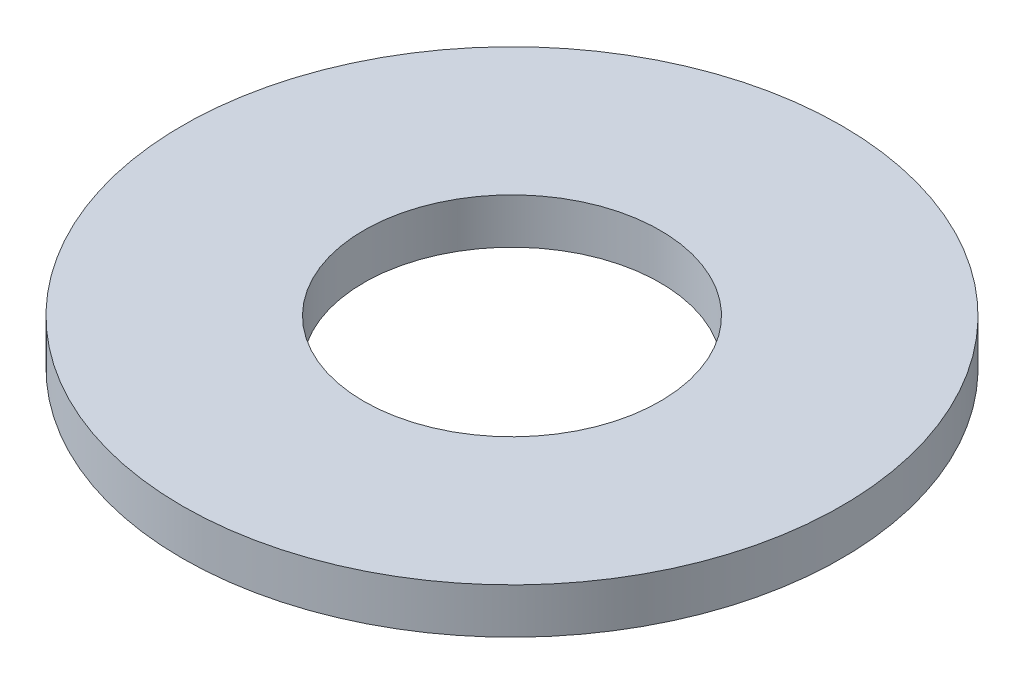
ISO-10303-21;
HEADER;
FILE_DESCRIPTION(('STEP AP214'),'2;1');
FILE_NAME('part.step','',(''),(''),'','','');
FILE_SCHEMA(('AUTOMOTIVE_DESIGN { 1 0 10303 214 1 1 1 1 }'));
ENDSEC;
DATA;
#1=APPLICATION_CONTEXT('core data for automotive mechanical design processes');
#2=APPLICATION_PROTOCOL_DEFINITION('international standard','automotive_design',2000,#1);
#3=PRODUCT_CONTEXT('',#1,'mechanical');
#4=PRODUCT('Part','Part','',(#3));
#5=PRODUCT_RELATED_PRODUCT_CATEGORY('part','',(#4));
#6=PRODUCT_DEFINITION_FORMATION('','',#4);
#7=PRODUCT_DEFINITION_CONTEXT('part definition',#1,'design');
#8=PRODUCT_DEFINITION('design','',#6,#7);
#9=PRODUCT_DEFINITION_SHAPE('','',#8);
#10=(LENGTH_UNIT() NAMED_UNIT(*) SI_UNIT(.MILLI.,.METRE.));
#11=(NAMED_UNIT(*) PLANE_ANGLE_UNIT() SI_UNIT($,.RADIAN.));
#12=(NAMED_UNIT(*) SI_UNIT($,.STERADIAN.) SOLID_ANGLE_UNIT());
#13=UNCERTAINTY_MEASURE_WITH_UNIT(LENGTH_MEASURE(1.E-05),#10,'distance_accuracy_value','');
#14=(GEOMETRIC_REPRESENTATION_CONTEXT(3) GLOBAL_UNCERTAINTY_ASSIGNED_CONTEXT((#13)) GLOBAL_UNIT_ASSIGNED_CONTEXT((#10,
#11,#12)) REPRESENTATION_CONTEXT('',''));
#15=CARTESIAN_POINT('',(0.,0.,0.));
#16=DIRECTION('',(0.,0.,1.));
#17=DIRECTION('',(1.,0.,0.));
#18=AXIS2_PLACEMENT_3D('',#15,#16,#17);
#19=CARTESIAN_POINT('',(0.,1.0922,0.));
#20=DIRECTION('',(0.,-1.,0.));
#21=DIRECTION('',(0.,0.,-1.));
#22=AXIS2_PLACEMENT_3D('',#19,#20,#21);
#23=CYLINDRICAL_SURFACE('',#22,7.9375);
#24=CARTESIAN_POINT('',(0.,1.0922,0.));
#25=DIRECTION('',(0.,1.,0.));
#26=DIRECTION('',(0.,0.,1.));
#27=AXIS2_PLACEMENT_3D('',#24,#25,#26);
#28=CIRCLE('',#27,7.9375);
#29=CARTESIAN_POINT('',(0.,1.0922,7.9375));
#30=VERTEX_POINT('',#29);
#31=EDGE_CURVE('E10',#30,#30,#28,.T.);
#32=ORIENTED_EDGE('',*,*,#31,.F.);
#33=EDGE_LOOP('',(#32));
#34=FACE_BOUND('',#33,.T.);
#35=CARTESIAN_POINT('',(0.,0.,0.));
#36=DIRECTION('',(0.,1.,0.));
#37=DIRECTION('',(0.,0.,1.));
#38=AXIS2_PLACEMENT_3D('',#35,#36,#37);
#39=CIRCLE('',#38,7.9375);
#40=CARTESIAN_POINT('',(0.,0.,7.9375));
#41=VERTEX_POINT('',#40);
#42=EDGE_CURVE('E35',#41,#41,#39,.T.);
#43=ORIENTED_EDGE('',*,*,#42,.T.);
#44=EDGE_LOOP('',(#43));
#45=FACE_BOUND('',#44,.T.);
#46=ADVANCED_FACE('F32',(#34,#45),#23,.T.);
#47=CARTESIAN_POINT('',(0.,1.0922,0.));
#48=DIRECTION('',(0.,1.,0.));
#49=DIRECTION('',(0.,0.,1.));
#50=AXIS2_PLACEMENT_3D('',#47,#48,#49);
#51=PLANE('',#50);
#52=CARTESIAN_POINT('',(0.,1.0922,0.));
#53=DIRECTION('',(0.,1.,0.));
#54=DIRECTION('',(0.,0.,1.));
#55=AXIS2_PLACEMENT_3D('',#52,#53,#54);
#56=CIRCLE('',#55,3.5687);
#57=CARTESIAN_POINT('',(0.,1.0922,3.5687));
#58=VERTEX_POINT('',#57);
#59=EDGE_CURVE('E44',#58,#58,#56,.T.);
#60=ORIENTED_EDGE('',*,*,#59,.F.);
#61=EDGE_LOOP('',(#60));
#62=FACE_BOUND('',#61,.T.);
#63=ORIENTED_EDGE('',*,*,#31,.T.);
#64=EDGE_LOOP('',(#63));
#65=FACE_BOUND('',#64,.T.);
#66=ADVANCED_FACE('F59',(#62,#65),#51,.T.);
#67=CARTESIAN_POINT('',(0.,0.,0.));
#68=DIRECTION('',(0.,1.,0.));
#69=DIRECTION('',(0.,0.,1.));
#70=AXIS2_PLACEMENT_3D('',#67,#68,#69);
#71=PLANE('',#70);
#72=CARTESIAN_POINT('',(0.,0.,0.));
#73=DIRECTION('',(0.,1.,0.));
#74=DIRECTION('',(0.,0.,1.));
#75=AXIS2_PLACEMENT_3D('',#72,#73,#74);
#76=CIRCLE('',#75,3.5687);
#77=CARTESIAN_POINT('',(0.,0.,3.5687));
#78=VERTEX_POINT('',#77);
#79=EDGE_CURVE('E42',#78,#78,#76,.T.);
#80=ORIENTED_EDGE('',*,*,#79,.T.);
#81=EDGE_LOOP('',(#80));
#82=FACE_BOUND('',#81,.T.);
#83=ORIENTED_EDGE('',*,*,#42,.F.);
#84=EDGE_LOOP('',(#83));
#85=FACE_BOUND('',#84,.T.);
#86=ADVANCED_FACE('F50',(#82,#85),#71,.F.);
#87=CARTESIAN_POINT('',(0.,0.,0.));
#88=DIRECTION('',(0.,1.,0.));
#89=DIRECTION('',(0.,0.,1.));
#90=AXIS2_PLACEMENT_3D('',#87,#88,#89);
#91=CYLINDRICAL_SURFACE('',#90,3.5687);
#92=ORIENTED_EDGE('',*,*,#79,.F.);
#93=EDGE_LOOP('',(#92));
#94=FACE_BOUND('',#93,.T.);
#95=ORIENTED_EDGE('',*,*,#59,.T.);
#96=EDGE_LOOP('',(#95));
#97=FACE_BOUND('',#96,.T.);
#98=ADVANCED_FACE('F53',(#94,#97),#91,.F.);
#99=CLOSED_SHELL('',(#46,#66,#86,#98));
#100=MANIFOLD_SOLID_BREP('B2',#99);
#101=ADVANCED_BREP_SHAPE_REPRESENTATION('',(#18,#100),#14);
#102=SHAPE_DEFINITION_REPRESENTATION(#9,#101);
ENDSEC;
END-ISO-10303-21;
